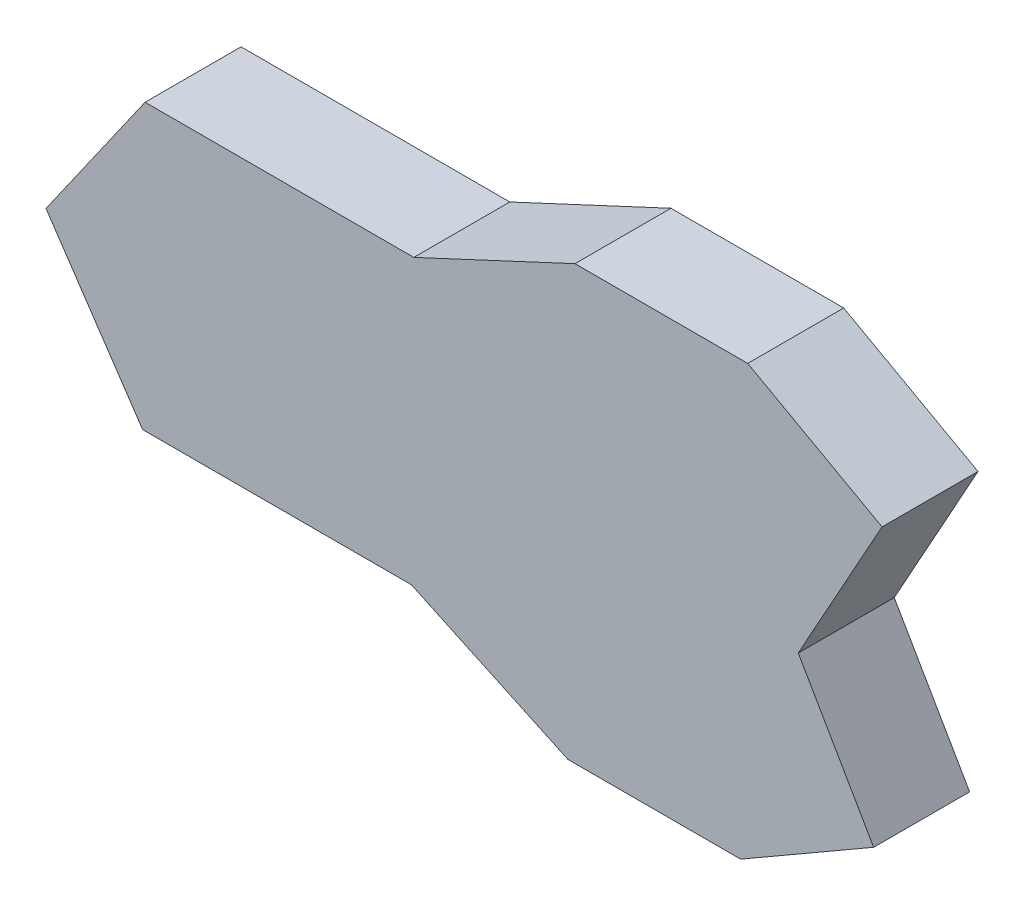
ISO-10303-21;
HEADER;
FILE_DESCRIPTION(('STEP AP214'),'2;1');
FILE_NAME('part.step','',(''),(''),'','','');
FILE_SCHEMA(('AUTOMOTIVE_DESIGN { 1 0 10303 214 1 1 1 1 }'));
ENDSEC;
DATA;
#1=APPLICATION_CONTEXT('core data for automotive mechanical design processes');
#2=APPLICATION_PROTOCOL_DEFINITION('international standard','automotive_design',2000,#1);
#3=PRODUCT_CONTEXT('',#1,'mechanical');
#4=PRODUCT('Part','Part','',(#3));
#5=PRODUCT_RELATED_PRODUCT_CATEGORY('part','',(#4));
#6=PRODUCT_DEFINITION_FORMATION('','',#4);
#7=PRODUCT_DEFINITION_CONTEXT('part definition',#1,'design');
#8=PRODUCT_DEFINITION('design','',#6,#7);
#9=PRODUCT_DEFINITION_SHAPE('','',#8);
#10=(LENGTH_UNIT() NAMED_UNIT(*) SI_UNIT(.MILLI.,.METRE.));
#11=(NAMED_UNIT(*) PLANE_ANGLE_UNIT() SI_UNIT($,.RADIAN.));
#12=(NAMED_UNIT(*) SI_UNIT($,.STERADIAN.) SOLID_ANGLE_UNIT());
#13=UNCERTAINTY_MEASURE_WITH_UNIT(LENGTH_MEASURE(1.E-05),#10,'distance_accuracy_value','');
#14=(GEOMETRIC_REPRESENTATION_CONTEXT(3) GLOBAL_UNCERTAINTY_ASSIGNED_CONTEXT((#13)) GLOBAL_UNIT_ASSIGNED_CONTEXT((#10,
#11,#12)) REPRESENTATION_CONTEXT('',''));
#15=CARTESIAN_POINT('',(0.,0.,0.));
#16=DIRECTION('',(0.,0.,1.));
#17=DIRECTION('',(1.,0.,0.));
#18=AXIS2_PLACEMENT_3D('',#15,#16,#17);
#19=CARTESIAN_POINT('',(0.,0.,63.5));
#20=DIRECTION('',(0.422618261740694,0.906307787036653,0.));
#21=DIRECTION('',(-0.906307787036653,0.422618261740694,0.));
#22=AXIS2_PLACEMENT_3D('',#19,#20,#21);
#23=PLANE('',#22);
#24=DIRECTION('',(0.906307787036653,-0.422618261740694,0.));
#25=VECTOR('',#24,1.);
#26=CARTESIAN_POINT('',(0.,0.,-63.5));
#27=LINE('',#26,#25);
#28=CARTESIAN_POINT('',(0.,0.,-63.5));
#29=VERTEX_POINT('',#28);
#30=CARTESIAN_POINT('',(207.181960116579,-96.6105346339226,-63.5));
#31=VERTEX_POINT('',#30);
#32=EDGE_CURVE('E168',#29,#31,#27,.T.);
#33=ORIENTED_EDGE('',*,*,#32,.T.);
#34=DIRECTION('',(0.,0.,-1.));
#35=VECTOR('',#34,1.);
#36=CARTESIAN_POINT('',(207.181960116579,-96.6105346339226,63.5));
#37=LINE('',#36,#35);
#38=CARTESIAN_POINT('',(207.181960116579,-96.6105346339226,63.5));
#39=VERTEX_POINT('',#38);
#40=EDGE_CURVE('E11',#39,#31,#37,.T.);
#41=ORIENTED_EDGE('',*,*,#40,.F.);
#42=DIRECTION('',(0.906307787036653,-0.422618261740694,0.));
#43=VECTOR('',#42,1.);
#44=CARTESIAN_POINT('',(0.,0.,63.5));
#45=LINE('',#44,#43);
#46=CARTESIAN_POINT('',(0.,0.,63.5));
#47=VERTEX_POINT('',#46);
#48=EDGE_CURVE('E202',#47,#39,#45,.T.);
#49=ORIENTED_EDGE('',*,*,#48,.F.);
#50=DIRECTION('',(0.,0.,-1.));
#51=VECTOR('',#50,1.);
#52=CARTESIAN_POINT('',(0.,0.,63.5));
#53=LINE('',#52,#51);
#54=EDGE_CURVE('E164',#47,#29,#53,.T.);
#55=ORIENTED_EDGE('',*,*,#54,.T.);
#56=EDGE_LOOP('',(#33,#41,#49,#55));
#57=FACE_BOUND('',#56,.T.);
#58=ADVANCED_FACE('F43',(#57),#23,.F.);
#59=CARTESIAN_POINT('',(207.181960116579,-96.6105346339226,63.5));
#60=DIRECTION('',(0.,1.,0.));
#61=DIRECTION('',(0.,0.,1.));
#62=AXIS2_PLACEMENT_3D('',#59,#60,#61);
#63=PLANE('',#62);
#64=DIRECTION('',(1.,0.,0.));
#65=VECTOR('',#64,1.);
#66=CARTESIAN_POINT('',(207.181960116579,-96.6105346339226,-63.5));
#67=LINE('',#66,#65);
#68=CARTESIAN_POINT('',(435.781960116579,-96.6105346339226,-63.5));
#69=VERTEX_POINT('',#68);
#70=EDGE_CURVE('E172',#31,#69,#67,.T.);
#71=ORIENTED_EDGE('',*,*,#70,.T.);
#72=DIRECTION('',(0.,0.,-1.));
#73=VECTOR('',#72,1.);
#74=CARTESIAN_POINT('',(435.781960116579,-96.6105346339226,63.5));
#75=LINE('',#74,#73);
#76=CARTESIAN_POINT('',(435.781960116579,-96.6105346339226,63.5));
#77=VERTEX_POINT('',#76);
#78=EDGE_CURVE('E52',#77,#69,#75,.T.);
#79=ORIENTED_EDGE('',*,*,#78,.F.);
#80=DIRECTION('',(1.,0.,0.));
#81=VECTOR('',#80,1.);
#82=CARTESIAN_POINT('',(207.181960116579,-96.6105346339226,63.5));
#83=LINE('',#82,#81);
#84=EDGE_CURVE('E115',#39,#77,#83,.T.);
#85=ORIENTED_EDGE('',*,*,#84,.F.);
#86=ORIENTED_EDGE('',*,*,#40,.T.);
#87=EDGE_LOOP('',(#71,#79,#85,#86));
#88=FACE_BOUND('',#87,.T.);
#89=ADVANCED_FACE('F296',(#88),#63,.F.);
#90=CARTESIAN_POINT('',(435.781960116579,-96.6105346339226,63.5));
#91=DIRECTION('',(-0.500000000000001,0.866025403784438,0.));
#92=DIRECTION('',(-0.866025403784438,-0.500000000000001,0.));
#93=AXIS2_PLACEMENT_3D('',#90,#91,#92);
#94=PLANE('',#93);
#95=DIRECTION('',(0.866025403784438,0.500000000000001,0.));
#96=VECTOR('',#95,1.);
#97=CARTESIAN_POINT('',(435.781960116579,-96.6105346339226,-63.5));
#98=LINE('',#97,#96);
#99=CARTESIAN_POINT('',(611.758322165577,4.98946536607772,-63.5));
#100=VERTEX_POINT('',#99);
#101=EDGE_CURVE('E175',#69,#100,#98,.T.);
#102=ORIENTED_EDGE('',*,*,#101,.T.);
#103=DIRECTION('',(0.,0.,-1.));
#104=VECTOR('',#103,1.);
#105=CARTESIAN_POINT('',(611.758322165577,4.98946536607772,63.5));
#106=LINE('',#105,#104);
#107=CARTESIAN_POINT('',(611.758322165577,4.98946536607772,63.5));
#108=VERTEX_POINT('',#107);
#109=EDGE_CURVE('E229',#108,#100,#106,.T.);
#110=ORIENTED_EDGE('',*,*,#109,.F.);
#111=DIRECTION('',(0.866025403784438,0.500000000000001,0.));
#112=VECTOR('',#111,1.);
#113=CARTESIAN_POINT('',(435.781960116579,-96.6105346339226,63.5));
#114=LINE('',#113,#112);
#115=EDGE_CURVE('E239',#77,#108,#114,.T.);
#116=ORIENTED_EDGE('',*,*,#115,.F.);
#117=ORIENTED_EDGE('',*,*,#78,.T.);
#118=EDGE_LOOP('',(#102,#110,#116,#117));
#119=FACE_BOUND('',#118,.T.);
#120=ADVANCED_FACE('F237',(#119),#94,.F.);
#121=CARTESIAN_POINT('',(611.758322165577,4.98946536607772,63.5));
#122=DIRECTION('',(-0.866025403784436,-0.500000000000004,0.));
#123=DIRECTION('',(0.500000000000004,-0.866025403784436,0.));
#124=AXIS2_PLACEMENT_3D('',#121,#122,#123);
#125=PLANE('',#124);
#126=DIRECTION('',(-0.500000000000004,0.866025403784436,0.));
#127=VECTOR('',#126,1.);
#128=CARTESIAN_POINT('',(611.758322165577,4.98946536607772,-63.5));
#129=LINE('',#128,#127);
#130=CARTESIAN_POINT('',(512.012104945008,177.754981454902,-63.5));
#131=VERTEX_POINT('',#130);
#132=EDGE_CURVE('E178',#100,#131,#129,.T.);
#133=ORIENTED_EDGE('',*,*,#132,.T.);
#134=DIRECTION('',(0.,0.,-1.));
#135=VECTOR('',#134,1.);
#136=CARTESIAN_POINT('',(512.012104945008,177.754981454902,63.5));
#137=LINE('',#136,#135);
#138=CARTESIAN_POINT('',(512.012104945008,177.754981454902,63.5));
#139=VERTEX_POINT('',#138);
#140=EDGE_CURVE('E225',#139,#131,#137,.T.);
#141=ORIENTED_EDGE('',*,*,#140,.F.);
#142=DIRECTION('',(-0.500000000000004,0.866025403784436,0.));
#143=VECTOR('',#142,1.);
#144=CARTESIAN_POINT('',(611.758322165577,4.98946536607772,63.5));
#145=LINE('',#144,#143);
#146=EDGE_CURVE('E258',#108,#139,#145,.T.);
#147=ORIENTED_EDGE('',*,*,#146,.F.);
#148=ORIENTED_EDGE('',*,*,#109,.T.);
#149=EDGE_LOOP('',(#133,#141,#147,#148));
#150=FACE_BOUND('',#149,.T.);
#151=ADVANCED_FACE('F248',(#150),#125,.F.);
#152=CARTESIAN_POINT('',(512.012104945008,177.754981454902,63.5));
#153=DIRECTION('',(-0.874619707139397,0.484809620246335,0.));
#154=DIRECTION('',(-0.484809620246335,-0.874619707139397,0.));
#155=AXIS2_PLACEMENT_3D('',#152,#153,#154);
#156=PLANE('',#155);
#157=DIRECTION('',(0.484809620246335,0.874619707139397,0.));
#158=VECTOR('',#157,1.);
#159=CARTESIAN_POINT('',(512.012104945008,177.754981454902,-63.5));
#160=LINE('',#159,#158);
#161=CARTESIAN_POINT('',(622.83958413332,377.693046506968,-63.5));
#162=VERTEX_POINT('',#161);
#163=EDGE_CURVE('E181',#131,#162,#160,.T.);
#164=ORIENTED_EDGE('',*,*,#163,.T.);
#165=DIRECTION('',(0.,0.,-1.));
#166=VECTOR('',#165,1.);
#167=CARTESIAN_POINT('',(622.83958413332,377.693046506968,63.5));
#168=LINE('',#167,#166);
#169=CARTESIAN_POINT('',(622.83958413332,377.693046506968,63.5));
#170=VERTEX_POINT('',#169);
#171=EDGE_CURVE('E221',#170,#162,#168,.T.);
#172=ORIENTED_EDGE('',*,*,#171,.F.);
#173=DIRECTION('',(0.484809620246335,0.874619707139397,0.));
#174=VECTOR('',#173,1.);
#175=CARTESIAN_POINT('',(512.012104945008,177.754981454902,63.5));
#176=LINE('',#175,#174);
#177=EDGE_CURVE('E254',#139,#170,#176,.T.);
#178=ORIENTED_EDGE('',*,*,#177,.F.);
#179=ORIENTED_EDGE('',*,*,#140,.T.);
#180=EDGE_LOOP('',(#164,#172,#178,#179));
#181=FACE_BOUND('',#180,.T.);
#182=ADVANCED_FACE('F252',(#181),#156,.F.);
#183=CARTESIAN_POINT('',(622.83958413332,377.693046506968,63.5));
#184=DIRECTION('',(-0.484809620246331,-0.874619707139399,0.));
#185=DIRECTION('',(0.874619707139399,-0.484809620246332,0.));
#186=AXIS2_PLACEMENT_3D('',#183,#184,#185);
#187=PLANE('',#186);
#188=DIRECTION('',(-0.874619707139399,0.484809620246331,0.));
#189=VECTOR('',#188,1.);
#190=CARTESIAN_POINT('',(622.83958413332,377.693046506968,-63.5));
#191=LINE('',#190,#189);
#192=CARTESIAN_POINT('',(445.116859642595,476.206361341023,-63.5));
#193=VERTEX_POINT('',#192);
#194=EDGE_CURVE('E184',#162,#193,#191,.T.);
#195=ORIENTED_EDGE('',*,*,#194,.T.);
#196=DIRECTION('',(0.,0.,-1.));
#197=VECTOR('',#196,1.);
#198=CARTESIAN_POINT('',(445.116859642595,476.206361341023,63.5));
#199=LINE('',#198,#197);
#200=CARTESIAN_POINT('',(445.116859642595,476.206361341023,63.5));
#201=VERTEX_POINT('',#200);
#202=EDGE_CURVE('E217',#201,#193,#199,.T.);
#203=ORIENTED_EDGE('',*,*,#202,.F.);
#204=DIRECTION('',(-0.874619707139399,0.484809620246331,0.));
#205=VECTOR('',#204,1.);
#206=CARTESIAN_POINT('',(622.83958413332,377.693046506968,63.5));
#207=LINE('',#206,#205);
#208=EDGE_CURVE('E257',#170,#201,#207,.T.);
#209=ORIENTED_EDGE('',*,*,#208,.F.);
#210=ORIENTED_EDGE('',*,*,#171,.T.);
#211=EDGE_LOOP('',(#195,#203,#209,#210));
#212=FACE_BOUND('',#211,.T.);
#213=ADVANCED_FACE('F309',(#212),#187,.F.);
#214=CARTESIAN_POINT('',(445.116859642595,476.206361341023,63.5));
#215=DIRECTION('',(0.,-1.,0.));
#216=DIRECTION('',(1.,0.,0.));
#217=AXIS2_PLACEMENT_3D('',#214,#215,#216);
#218=PLANE('',#217);
#219=DIRECTION('',(-1.,0.,0.));
#220=VECTOR('',#219,1.);
#221=CARTESIAN_POINT('',(445.116859642595,476.206361341023,-63.5));
#222=LINE('',#221,#220);
#223=CARTESIAN_POINT('',(216.516859642595,476.206361341022,-63.5));
#224=VERTEX_POINT('',#223);
#225=EDGE_CURVE('E187',#193,#224,#222,.T.);
#226=ORIENTED_EDGE('',*,*,#225,.T.);
#227=DIRECTION('',(0.,0.,-1.));
#228=VECTOR('',#227,1.);
#229=CARTESIAN_POINT('',(216.516859642595,476.206361341022,63.5));
#230=LINE('',#229,#228);
#231=CARTESIAN_POINT('',(216.516859642595,476.206361341022,63.5));
#232=VERTEX_POINT('',#231);
#233=EDGE_CURVE('E213',#232,#224,#230,.T.);
#234=ORIENTED_EDGE('',*,*,#233,.F.);
#235=DIRECTION('',(-1.,0.,0.));
#236=VECTOR('',#235,1.);
#237=CARTESIAN_POINT('',(445.116859642595,476.206361341023,63.5));
#238=LINE('',#237,#236);
#239=EDGE_CURVE('E262',#201,#232,#238,.T.);
#240=ORIENTED_EDGE('',*,*,#239,.F.);
#241=ORIENTED_EDGE('',*,*,#202,.T.);
#242=EDGE_LOOP('',(#226,#234,#240,#241));
#243=FACE_BOUND('',#242,.T.);
#244=ADVANCED_FACE('F312',(#243),#218,.F.);
#245=CARTESIAN_POINT('',(216.516859642595,476.206361341022,63.5));
#246=DIRECTION('',(0.422618261740701,-0.906307787036649,0.));
#247=DIRECTION('',(0.906307787036649,0.422618261740701,0.));
#248=AXIS2_PLACEMENT_3D('',#245,#246,#247);
#249=PLANE('',#248);
#250=DIRECTION('',(-0.906307787036649,-0.422618261740701,0.));
#251=VECTOR('',#250,1.);
#252=CARTESIAN_POINT('',(216.516859642595,476.206361341022,-63.5));
#253=LINE('',#252,#251);
#254=CARTESIAN_POINT('',(3.28807561643468,376.776146410545,-63.5));
#255=VERTEX_POINT('',#254);
#256=EDGE_CURVE('E190',#224,#255,#253,.T.);
#257=ORIENTED_EDGE('',*,*,#256,.T.);
#258=DIRECTION('',(0.,0.,-1.));
#259=VECTOR('',#258,1.);
#260=CARTESIAN_POINT('',(3.28807561643468,376.776146410545,63.5));
#261=LINE('',#260,#259);
#262=CARTESIAN_POINT('',(3.28807561643468,376.776146410545,63.5));
#263=VERTEX_POINT('',#262);
#264=EDGE_CURVE('E209',#263,#255,#261,.T.);
#265=ORIENTED_EDGE('',*,*,#264,.F.);
#266=DIRECTION('',(-0.906307787036649,-0.422618261740701,0.));
#267=VECTOR('',#266,1.);
#268=CARTESIAN_POINT('',(216.516859642595,476.206361341022,63.5));
#269=LINE('',#268,#267);
#270=EDGE_CURVE('E269',#232,#263,#269,.T.);
#271=ORIENTED_EDGE('',*,*,#270,.F.);
#272=ORIENTED_EDGE('',*,*,#233,.T.);
#273=EDGE_LOOP('',(#257,#265,#271,#272));
#274=FACE_BOUND('',#273,.T.);
#275=ADVANCED_FACE('F277',(#274),#249,.F.);
#276=CARTESIAN_POINT('',(-352.311924383565,376.776146410545,63.5));
#277=DIRECTION('',(0.,-1.,0.));
#278=DIRECTION('',(1.,0.,0.));
#279=AXIS2_PLACEMENT_3D('',#276,#277,#278);
#280=PLANE('',#279);
#281=DIRECTION('',(-1.,0.,0.));
#282=VECTOR('',#281,1.);
#283=CARTESIAN_POINT('',(-352.311924383565,376.776146410545,-63.5));
#284=LINE('',#283,#282);
#285=CARTESIAN_POINT('',(-352.311924383565,376.776146410545,-63.5));
#286=VERTEX_POINT('',#285);
#287=EDGE_CURVE('E193',#255,#286,#284,.T.);
#288=ORIENTED_EDGE('',*,*,#287,.T.);
#289=DIRECTION('',(0.,0.,-1.));
#290=VECTOR('',#289,1.);
#291=CARTESIAN_POINT('',(-352.311924383565,376.776146410545,63.5));
#292=LINE('',#291,#290);
#293=CARTESIAN_POINT('',(-352.311924383565,376.776146410545,63.5));
#294=VERTEX_POINT('',#293);
#295=EDGE_CURVE('E157',#294,#286,#292,.T.);
#296=ORIENTED_EDGE('',*,*,#295,.F.);
#297=DIRECTION('',(-1.,0.,0.));
#298=VECTOR('',#297,1.);
#299=CARTESIAN_POINT('',(-352.311924383565,376.776146410545,63.5));
#300=LINE('',#299,#298);
#301=EDGE_CURVE('E146',#263,#294,#300,.T.);
#302=ORIENTED_EDGE('',*,*,#301,.F.);
#303=ORIENTED_EDGE('',*,*,#264,.T.);
#304=EDGE_LOOP('',(#288,#296,#302,#303));
#305=FACE_BOUND('',#304,.T.);
#306=ADVANCED_FACE('F281',(#305),#280,.F.);
#307=CARTESIAN_POINT('',(-483.431497733414,189.517989086082,63.5));
#308=DIRECTION('',(0.819152044288993,-0.573576436351044,0.));
#309=DIRECTION('',(0.573576436351044,0.819152044288993,0.));
#310=AXIS2_PLACEMENT_3D('',#307,#308,#309);
#311=PLANE('',#310);
#312=DIRECTION('',(-0.573576436351044,-0.819152044288993,0.));
#313=VECTOR('',#312,1.);
#314=CARTESIAN_POINT('',(-483.431497733414,189.517989086082,-63.5));
#315=LINE('',#314,#313);
#316=CARTESIAN_POINT('',(-483.431497733414,189.517989086082,-63.5));
#317=VERTEX_POINT('',#316);
#318=EDGE_CURVE('E155',#286,#317,#315,.T.);
#319=ORIENTED_EDGE('',*,*,#318,.T.);
#320=DIRECTION('',(0.,0.,-1.));
#321=VECTOR('',#320,1.);
#322=CARTESIAN_POINT('',(-483.431497733414,189.517989086082,63.5));
#323=LINE('',#322,#321);
#324=CARTESIAN_POINT('',(-483.431497733414,189.517989086082,63.5));
#325=VERTEX_POINT('',#324);
#326=EDGE_CURVE('E152',#325,#317,#323,.T.);
#327=ORIENTED_EDGE('',*,*,#326,.F.);
#328=DIRECTION('',(-0.573576436351044,-0.819152044288993,0.));
#329=VECTOR('',#328,1.);
#330=CARTESIAN_POINT('',(-483.431497733414,189.517989086082,63.5));
#331=LINE('',#330,#329);
#332=EDGE_CURVE('E140',#294,#325,#331,.T.);
#333=ORIENTED_EDGE('',*,*,#332,.F.);
#334=ORIENTED_EDGE('',*,*,#295,.T.);
#335=EDGE_LOOP('',(#319,#327,#333,#334));
#336=FACE_BOUND('',#335,.T.);
#337=ADVANCED_FACE('F153',(#336),#311,.F.);
#338=CARTESIAN_POINT('',(-355.6,0.,63.5));
#339=DIRECTION('',(0.829037572555038,0.559192903470752,0.));
#340=DIRECTION('',(-0.559192903470752,0.829037572555038,0.));
#341=AXIS2_PLACEMENT_3D('',#338,#339,#340);
#342=PLANE('',#341);
#343=DIRECTION('',(0.559192903470752,-0.829037572555038,0.));
#344=VECTOR('',#343,1.);
#345=CARTESIAN_POINT('',(-355.6,0.,-63.5));
#346=LINE('',#345,#344);
#347=CARTESIAN_POINT('',(-355.6,0.,-63.5));
#348=VERTEX_POINT('',#347);
#349=EDGE_CURVE('E101',#317,#348,#346,.T.);
#350=ORIENTED_EDGE('',*,*,#349,.T.);
#351=DIRECTION('',(0.,0.,-1.));
#352=VECTOR('',#351,1.);
#353=CARTESIAN_POINT('',(-355.6,0.,63.5));
#354=LINE('',#353,#352);
#355=CARTESIAN_POINT('',(-355.6,0.,63.5));
#356=VERTEX_POINT('',#355);
#357=EDGE_CURVE('E158',#356,#348,#354,.T.);
#358=ORIENTED_EDGE('',*,*,#357,.F.);
#359=DIRECTION('',(0.559192903470752,-0.829037572555038,0.));
#360=VECTOR('',#359,1.);
#361=CARTESIAN_POINT('',(-355.6,0.,63.5));
#362=LINE('',#361,#360);
#363=EDGE_CURVE('E144',#325,#356,#362,.T.);
#364=ORIENTED_EDGE('',*,*,#363,.F.);
#365=ORIENTED_EDGE('',*,*,#326,.T.);
#366=EDGE_LOOP('',(#350,#358,#364,#365));
#367=FACE_BOUND('',#366,.T.);
#368=ADVANCED_FACE('F160',(#367),#342,.F.);
#369=CARTESIAN_POINT('',(0.,0.,63.5));
#370=DIRECTION('',(0.,1.,0.));
#371=DIRECTION('',(-1.,0.,0.));
#372=AXIS2_PLACEMENT_3D('',#369,#370,#371);
#373=PLANE('',#372);
#374=DIRECTION('',(1.,0.,0.));
#375=VECTOR('',#374,1.);
#376=CARTESIAN_POINT('',(0.,0.,-63.5));
#377=LINE('',#376,#375);
#378=EDGE_CURVE('E107',#348,#29,#377,.T.);
#379=ORIENTED_EDGE('',*,*,#378,.T.);
#380=ORIENTED_EDGE('',*,*,#54,.F.);
#381=DIRECTION('',(1.,0.,0.));
#382=VECTOR('',#381,1.);
#383=CARTESIAN_POINT('',(0.,0.,63.5));
#384=LINE('',#383,#382);
#385=EDGE_CURVE('E60',#356,#47,#384,.T.);
#386=ORIENTED_EDGE('',*,*,#385,.F.);
#387=ORIENTED_EDGE('',*,*,#357,.T.);
#388=EDGE_LOOP('',(#379,#380,#386,#387));
#389=FACE_BOUND('',#388,.T.);
#390=ADVANCED_FACE('F285',(#389),#373,.F.);
#391=CARTESIAN_POINT('',(0.,0.,63.5));
#392=DIRECTION('',(0.,0.,1.));
#393=DIRECTION('',(1.,0.,0.));
#394=AXIS2_PLACEMENT_3D('',#391,#392,#393);
#395=PLANE('',#394);
#396=ORIENTED_EDGE('',*,*,#48,.T.);
#397=ORIENTED_EDGE('',*,*,#84,.T.);
#398=ORIENTED_EDGE('',*,*,#115,.T.);
#399=ORIENTED_EDGE('',*,*,#146,.T.);
#400=ORIENTED_EDGE('',*,*,#177,.T.);
#401=ORIENTED_EDGE('',*,*,#208,.T.);
#402=ORIENTED_EDGE('',*,*,#239,.T.);
#403=ORIENTED_EDGE('',*,*,#270,.T.);
#404=ORIENTED_EDGE('',*,*,#301,.T.);
#405=ORIENTED_EDGE('',*,*,#332,.T.);
#406=ORIENTED_EDGE('',*,*,#363,.T.);
#407=ORIENTED_EDGE('',*,*,#385,.T.);
#408=EDGE_LOOP('',(#396,#397,#398,#399,#400,#401,#402,#403,#404,#405,#406,#407));
#409=FACE_BOUND('',#408,.T.);
#410=ADVANCED_FACE('F142',(#409),#395,.T.);
#411=CARTESIAN_POINT('',(0.,0.,-63.5));
#412=DIRECTION('',(0.,0.,1.));
#413=DIRECTION('',(1.,0.,0.));
#414=AXIS2_PLACEMENT_3D('',#411,#412,#413);
#415=PLANE('',#414);
#416=ORIENTED_EDGE('',*,*,#32,.F.);
#417=ORIENTED_EDGE('',*,*,#378,.F.);
#418=ORIENTED_EDGE('',*,*,#349,.F.);
#419=ORIENTED_EDGE('',*,*,#318,.F.);
#420=ORIENTED_EDGE('',*,*,#287,.F.);
#421=ORIENTED_EDGE('',*,*,#256,.F.);
#422=ORIENTED_EDGE('',*,*,#225,.F.);
#423=ORIENTED_EDGE('',*,*,#194,.F.);
#424=ORIENTED_EDGE('',*,*,#163,.F.);
#425=ORIENTED_EDGE('',*,*,#132,.F.);
#426=ORIENTED_EDGE('',*,*,#101,.F.);
#427=ORIENTED_EDGE('',*,*,#70,.F.);
#428=EDGE_LOOP('',(#416,#417,#418,#419,#420,#421,#422,#423,#424,#425,#426,#427));
#429=FACE_BOUND('',#428,.T.);
#430=ADVANCED_FACE('F243',(#429),#415,.F.);
#431=CLOSED_SHELL('',(#58,#89,#120,#151,#182,#213,#244,#275,#306,#337,#368,#390,#410,#430));
#432=MANIFOLD_SOLID_BREP('B2',#431);
#433=ADVANCED_BREP_SHAPE_REPRESENTATION('',(#18,#432),#14);
#434=SHAPE_DEFINITION_REPRESENTATION(#9,#433);
ENDSEC;
END-ISO-10303-21;
